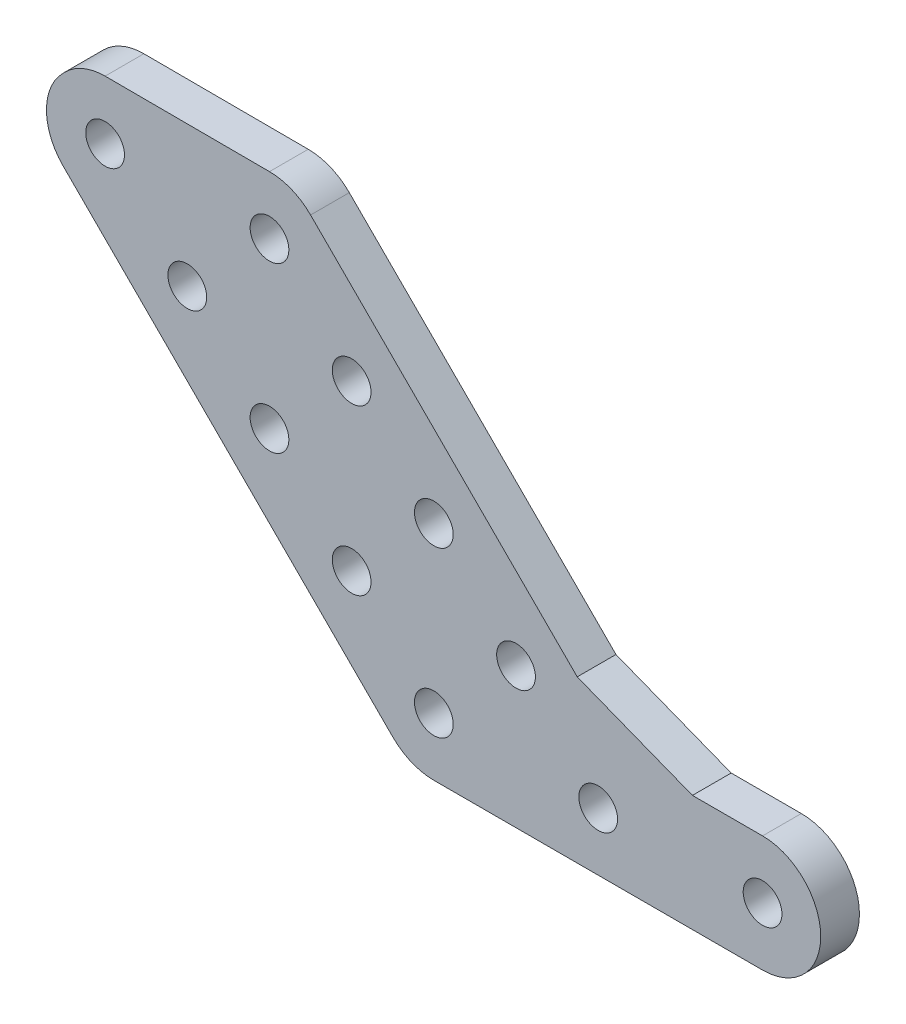
ISO-10303-21;
HEADER;
FILE_DESCRIPTION(('STEP AP214'),'2;1');
FILE_NAME('part.step','',(''),(''),'','','');
FILE_SCHEMA(('AUTOMOTIVE_DESIGN { 1 0 10303 214 1 1 1 1 }'));
ENDSEC;
DATA;
#1=APPLICATION_CONTEXT('core data for automotive mechanical design processes');
#2=APPLICATION_PROTOCOL_DEFINITION('international standard','automotive_design',2000,#1);
#3=PRODUCT_CONTEXT('',#1,'mechanical');
#4=PRODUCT('Part','Part','',(#3));
#5=PRODUCT_RELATED_PRODUCT_CATEGORY('part','',(#4));
#6=PRODUCT_DEFINITION_FORMATION('','',#4);
#7=PRODUCT_DEFINITION_CONTEXT('part definition',#1,'design');
#8=PRODUCT_DEFINITION('design','',#6,#7);
#9=PRODUCT_DEFINITION_SHAPE('','',#8);
#10=(LENGTH_UNIT() NAMED_UNIT(*) SI_UNIT(.MILLI.,.METRE.));
#11=(NAMED_UNIT(*) PLANE_ANGLE_UNIT() SI_UNIT($,.RADIAN.));
#12=(NAMED_UNIT(*) SI_UNIT($,.STERADIAN.) SOLID_ANGLE_UNIT());
#13=UNCERTAINTY_MEASURE_WITH_UNIT(LENGTH_MEASURE(1.E-05),#10,'distance_accuracy_value','');
#14=(GEOMETRIC_REPRESENTATION_CONTEXT(3) GLOBAL_UNCERTAINTY_ASSIGNED_CONTEXT((#13)) GLOBAL_UNIT_ASSIGNED_CONTEXT((#10,
#11,#12)) REPRESENTATION_CONTEXT('',''));
#15=CARTESIAN_POINT('',(0.,0.,0.));
#16=DIRECTION('',(0.,0.,1.));
#17=DIRECTION('',(1.,0.,0.));
#18=AXIS2_PLACEMENT_3D('',#15,#16,#17);
#19=CARTESIAN_POINT('',(237.5387643673,237.5387643673,3.));
#20=DIRECTION('',(0.707106781186548,0.707106781186546,0.));
#21=DIRECTION('',(-0.707106781186547,0.707106781186549,0.));
#22=AXIS2_PLACEMENT_3D('',#19,#20,#21);
#23=PLANE('',#22);
#24=DIRECTION('',(0.707106781186547,-0.707106781186549,0.));
#25=VECTOR('',#24,1.);
#26=CARTESIAN_POINT('',(237.5387643673,237.5387643673,0.));
#27=LINE('',#26,#25);
#28=CARTESIAN_POINT('',(163.6113708686,311.466157866,0.));
#29=VERTEX_POINT('',#28);
#30=CARTESIAN_POINT('',(184.260234476,290.8172942586,0.));
#31=VERTEX_POINT('',#30);
#32=EDGE_CURVE('E184',#29,#31,#27,.T.);
#33=ORIENTED_EDGE('',*,*,#32,.F.);
#34=DIRECTION('',(0.,0.,-1.));
#35=VECTOR('',#34,1.);
#36=CARTESIAN_POINT('',(163.6113708686,311.466157866,3.));
#37=LINE('',#36,#35);
#38=CARTESIAN_POINT('',(163.6113708686,311.466157866,3.));
#39=VERTEX_POINT('',#38);
#40=EDGE_CURVE('E11',#39,#29,#37,.T.);
#41=ORIENTED_EDGE('',*,*,#40,.F.);
#42=DIRECTION('',(0.707106781186547,-0.707106781186549,0.));
#43=VECTOR('',#42,1.);
#44=CARTESIAN_POINT('',(237.5387643673,237.5387643673,3.));
#45=LINE('',#44,#43);
#46=CARTESIAN_POINT('',(184.260234476,290.8172942586,3.));
#47=VERTEX_POINT('',#46);
#48=EDGE_CURVE('E257',#39,#47,#45,.T.);
#49=ORIENTED_EDGE('',*,*,#48,.T.);
#50=DIRECTION('',(0.,0.,-1.));
#51=VECTOR('',#50,1.);
#52=CARTESIAN_POINT('',(184.260234476,290.8172942586,3.));
#53=LINE('',#52,#51);
#54=EDGE_CURVE('E50',#47,#31,#53,.T.);
#55=ORIENTED_EDGE('',*,*,#54,.T.);
#56=EDGE_LOOP('',(#33,#41,#49,#55));
#57=FACE_BOUND('',#56,.T.);
#58=ADVANCED_FACE('F33',(#57),#23,.T.);
#59=CARTESIAN_POINT('',(160.429390353221,308.2841773507,3.));
#60=DIRECTION('',(0.,0.,-1.));
#61=DIRECTION('',(-1.,0.,0.));
#62=AXIS2_PLACEMENT_3D('',#59,#60,#61);
#63=CYLINDRICAL_SURFACE('',#62,4.50000000000005);
#64=CARTESIAN_POINT('',(160.429390353221,308.2841773507,0.));
#65=DIRECTION('',(0.,0.,1.));
#66=DIRECTION('',(1.,0.,0.));
#67=AXIS2_PLACEMENT_3D('',#64,#65,#66);
#68=CIRCLE('',#67,4.50000000000005);
#69=CARTESIAN_POINT('',(160.4293903532,312.7841773507,0.));
#70=VERTEX_POINT('',#69);
#71=EDGE_CURVE('E186',#29,#70,#68,.T.);
#72=ORIENTED_EDGE('',*,*,#71,.T.);
#73=DIRECTION('',(0.,0.,-1.));
#74=VECTOR('',#73,1.);
#75=CARTESIAN_POINT('',(160.4293903532,312.7841773507,3.));
#76=LINE('',#75,#74);
#77=CARTESIAN_POINT('',(160.4293903532,312.7841773507,3.));
#78=VERTEX_POINT('',#77);
#79=EDGE_CURVE('E42',#78,#70,#76,.T.);
#80=ORIENTED_EDGE('',*,*,#79,.F.);
#81=CARTESIAN_POINT('',(160.429390353221,308.2841773507,3.));
#82=DIRECTION('',(0.,0.,1.));
#83=DIRECTION('',(1.,0.,0.));
#84=AXIS2_PLACEMENT_3D('',#81,#82,#83);
#85=CIRCLE('',#84,4.50000000000005);
#86=EDGE_CURVE('E255',#39,#78,#85,.T.);
#87=ORIENTED_EDGE('',*,*,#86,.F.);
#88=ORIENTED_EDGE('',*,*,#40,.T.);
#89=EDGE_LOOP('',(#72,#80,#87,#88));
#90=FACE_BOUND('',#89,.T.);
#91=ADVANCED_FACE('F240',(#90),#63,.T.);
#92=CARTESIAN_POINT('',(1.01960345619282,313.30295563462,3.));
#93=DIRECTION('',(0.00325435186176916,0.999994704582959,0.));
#94=DIRECTION('',(-0.999994704582959,0.00325435186176916,0.));
#95=AXIS2_PLACEMENT_3D('',#92,#93,#94);
#96=PLANE('',#95);
#97=DIRECTION('',(0.999994704582959,-0.00325435186176916,0.));
#98=VECTOR('',#97,1.);
#99=CARTESIAN_POINT('',(1.01960345619282,313.30295563462,0.));
#100=LINE('',#99,#98);
#101=CARTESIAN_POINT('',(147.7014682919,312.8255987069,0.));
#102=VERTEX_POINT('',#101);
#103=EDGE_CURVE('E189',#102,#70,#100,.T.);
#104=ORIENTED_EDGE('',*,*,#103,.F.);
#105=DIRECTION('',(0.,0.,-1.));
#106=VECTOR('',#105,1.);
#107=CARTESIAN_POINT('',(147.7014682919,312.8255987069,3.));
#108=LINE('',#107,#106);
#109=CARTESIAN_POINT('',(147.7014682919,312.8255987069,3.));
#110=VERTEX_POINT('',#109);
#111=EDGE_CURVE('E230',#110,#102,#108,.T.);
#112=ORIENTED_EDGE('',*,*,#111,.F.);
#113=DIRECTION('',(0.999994704582959,-0.00325435186176916,0.));
#114=VECTOR('',#113,1.);
#115=CARTESIAN_POINT('',(1.01960345619282,313.30295563462,3.));
#116=LINE('',#115,#114);
#117=EDGE_CURVE('E237',#110,#78,#116,.T.);
#118=ORIENTED_EDGE('',*,*,#117,.T.);
#119=ORIENTED_EDGE('',*,*,#79,.T.);
#120=EDGE_LOOP('',(#104,#112,#118,#119));
#121=FACE_BOUND('',#120,.T.);
#122=ADVANCED_FACE('F235',(#121),#96,.T.);
#123=CARTESIAN_POINT('',(147.701468291942,308.4255987069,3.));
#124=DIRECTION('',(0.,0.,-1.));
#125=DIRECTION('',(-1.,0.,0.));
#126=AXIS2_PLACEMENT_3D('',#123,#124,#125);
#127=CYLINDRICAL_SURFACE('',#126,4.40000000000009);
#128=CARTESIAN_POINT('',(147.701468291942,308.4255987069,0.));
#129=DIRECTION('',(0.,0.,1.));
#130=DIRECTION('',(1.,0.,0.));
#131=AXIS2_PLACEMENT_3D('',#128,#129,#130);
#132=CIRCLE('',#131,4.40000000000009);
#133=CARTESIAN_POINT('',(144.5901984547,311.5368685441,0.));
#134=VERTEX_POINT('',#133);
#135=EDGE_CURVE('E192',#102,#134,#132,.T.);
#136=ORIENTED_EDGE('',*,*,#135,.T.);
#137=DIRECTION('',(0.,0.,-1.));
#138=VECTOR('',#137,1.);
#139=CARTESIAN_POINT('',(144.5901984547,311.5368685441,3.));
#140=LINE('',#139,#138);
#141=CARTESIAN_POINT('',(144.5901984547,311.5368685441,3.));
#142=VERTEX_POINT('',#141);
#143=EDGE_CURVE('E228',#142,#134,#140,.T.);
#144=ORIENTED_EDGE('',*,*,#143,.F.);
#145=CARTESIAN_POINT('',(147.701468291942,308.4255987069,3.));
#146=DIRECTION('',(0.,0.,1.));
#147=DIRECTION('',(1.,0.,0.));
#148=AXIS2_PLACEMENT_3D('',#145,#146,#147);
#149=CIRCLE('',#148,4.40000000000009);
#150=EDGE_CURVE('E251',#110,#142,#149,.T.);
#151=ORIENTED_EDGE('',*,*,#150,.F.);
#152=ORIENTED_EDGE('',*,*,#111,.T.);
#153=EDGE_LOOP('',(#136,#144,#151,#152));
#154=FACE_BOUND('',#153,.T.);
#155=ADVANCED_FACE('F248',(#154),#127,.T.);
#156=CARTESIAN_POINT('',(-83.4733350958221,83.4733351548486,3.));
#157=DIRECTION('',(-0.707106780936539,0.707106781436556,0.));
#158=DIRECTION('',(-0.707106781436556,-0.707106780936539,0.));
#159=AXIS2_PLACEMENT_3D('',#156,#157,#158);
#160=PLANE('',#159);
#161=DIRECTION('',(0.707106781436556,0.707106780936539,0.));
#162=VECTOR('',#161,1.);
#163=CARTESIAN_POINT('',(-83.4733350958221,83.4733351548486,0.));
#164=LINE('',#163,#162);
#165=CARTESIAN_POINT('',(144.4487770984,311.3954471879,0.));
#166=VERTEX_POINT('',#165);
#167=EDGE_CURVE('E195',#166,#134,#164,.T.);
#168=ORIENTED_EDGE('',*,*,#167,.F.);
#169=DIRECTION('',(0.,0.,-1.));
#170=VECTOR('',#169,1.);
#171=CARTESIAN_POINT('',(144.4487770984,311.3954471879,3.));
#172=LINE('',#171,#170);
#173=CARTESIAN_POINT('',(144.4487770984,311.3954471879,3.));
#174=VERTEX_POINT('',#173);
#175=EDGE_CURVE('E226',#174,#166,#172,.T.);
#176=ORIENTED_EDGE('',*,*,#175,.F.);
#177=DIRECTION('',(0.707106781436556,0.707106780936539,0.));
#178=VECTOR('',#177,1.);
#179=CARTESIAN_POINT('',(-83.4733350958221,83.4733351548486,3.));
#180=LINE('',#179,#178);
#181=EDGE_CURVE('E253',#174,#142,#180,.T.);
#182=ORIENTED_EDGE('',*,*,#181,.T.);
#183=ORIENTED_EDGE('',*,*,#143,.T.);
#184=EDGE_LOOP('',(#168,#176,#182,#183));
#185=FACE_BOUND('',#184,.T.);
#186=ADVANCED_FACE('F497',(#185),#160,.T.);
#187=CARTESIAN_POINT('',(147.560046935642,308.2841773507,3.));
#188=DIRECTION('',(0.,0.,-1.));
#189=DIRECTION('',(-1.,0.,0.));
#190=AXIS2_PLACEMENT_3D('',#187,#188,#189);
#191=CYLINDRICAL_SURFACE('',#190,4.40000000000009);
#192=CARTESIAN_POINT('',(147.560046935642,308.2841773507,0.));
#193=DIRECTION('',(0.,0.,1.));
#194=DIRECTION('',(1.,0.,0.));
#195=AXIS2_PLACEMENT_3D('',#192,#193,#194);
#196=CIRCLE('',#195,4.40000000000009);
#197=CARTESIAN_POINT('',(144.4487770984,305.1729075135,0.));
#198=VERTEX_POINT('',#197);
#199=EDGE_CURVE('E198',#166,#198,#196,.T.);
#200=ORIENTED_EDGE('',*,*,#199,.T.);
#201=DIRECTION('',(0.,0.,-1.));
#202=VECTOR('',#201,1.);
#203=CARTESIAN_POINT('',(144.4487770984,305.1729075135,3.));
#204=LINE('',#203,#202);
#205=CARTESIAN_POINT('',(144.4487770984,305.1729075135,3.));
#206=VERTEX_POINT('',#205);
#207=EDGE_CURVE('E224',#206,#198,#204,.T.);
#208=ORIENTED_EDGE('',*,*,#207,.F.);
#209=CARTESIAN_POINT('',(147.560046935642,308.2841773507,3.));
#210=DIRECTION('',(0.,0.,1.));
#211=DIRECTION('',(1.,0.,0.));
#212=AXIS2_PLACEMENT_3D('',#209,#210,#211);
#213=CIRCLE('',#212,4.40000000000009);
#214=EDGE_CURVE('E262',#174,#206,#213,.T.);
#215=ORIENTED_EDGE('',*,*,#214,.F.);
#216=ORIENTED_EDGE('',*,*,#175,.T.);
#217=EDGE_LOOP('',(#200,#208,#215,#216));
#218=FACE_BOUND('',#217,.T.);
#219=ADVANCED_FACE('F487',(#218),#191,.T.);
#220=CARTESIAN_POINT('',(224.81084230595,224.81084230595,3.));
#221=DIRECTION('',(-0.707106781186547,-0.707106781186548,0.));
#222=DIRECTION('',(0.707106781186548,-0.707106781186547,0.));
#223=AXIS2_PLACEMENT_3D('',#220,#221,#222);
#224=PLANE('',#223);
#225=DIRECTION('',(-0.707106781186548,0.707106781186547,0.));
#226=VECTOR('',#225,1.);
#227=CARTESIAN_POINT('',(224.81084230595,224.81084230595,0.));
#228=LINE('',#227,#226);
#229=CARTESIAN_POINT('',(169.9753318993,279.6463527126,0.));
#230=VERTEX_POINT('',#229);
#231=EDGE_CURVE('E201',#230,#198,#228,.T.);
#232=ORIENTED_EDGE('',*,*,#231,.F.);
#233=DIRECTION('',(0.,0.,-1.));
#234=VECTOR('',#233,1.);
#235=CARTESIAN_POINT('',(169.9753318993,279.6463527126,3.));
#236=LINE('',#235,#234);
#237=CARTESIAN_POINT('',(169.9753318993,279.6463527126,3.));
#238=VERTEX_POINT('',#237);
#239=EDGE_CURVE('E222',#238,#230,#236,.T.);
#240=ORIENTED_EDGE('',*,*,#239,.F.);
#241=DIRECTION('',(-0.707106781186548,0.707106781186547,0.));
#242=VECTOR('',#241,1.);
#243=CARTESIAN_POINT('',(224.81084230595,224.81084230595,3.));
#244=LINE('',#243,#242);
#245=EDGE_CURVE('E264',#238,#206,#244,.T.);
#246=ORIENTED_EDGE('',*,*,#245,.T.);
#247=ORIENTED_EDGE('',*,*,#207,.T.);
#248=EDGE_LOOP('',(#232,#240,#246,#247));
#249=FACE_BOUND('',#248,.T.);
#250=ADVANCED_FACE('F477',(#249),#224,.T.);
#251=CARTESIAN_POINT('',(173.1573124146,282.828333228,3.));
#252=DIRECTION('',(0.,0.,-1.));
#253=DIRECTION('',(-1.,0.,0.));
#254=AXIS2_PLACEMENT_3D('',#251,#252,#253);
#255=CYLINDRICAL_SURFACE('',#254,4.50000000000746);
#256=CARTESIAN_POINT('',(173.1573124146,282.828333228,0.));
#257=DIRECTION('',(0.,0.,1.));
#258=DIRECTION('',(1.,0.,0.));
#259=AXIS2_PLACEMENT_3D('',#256,#257,#258);
#260=CIRCLE('',#259,4.50000000000746);
#261=CARTESIAN_POINT('',(173.1573124146,278.328333228,0.));
#262=VERTEX_POINT('',#261);
#263=EDGE_CURVE('E204',#230,#262,#260,.T.);
#264=ORIENTED_EDGE('',*,*,#263,.T.);
#265=DIRECTION('',(0.,0.,-1.));
#266=VECTOR('',#265,1.);
#267=CARTESIAN_POINT('',(173.1573124146,278.328333228,3.));
#268=LINE('',#267,#266);
#269=CARTESIAN_POINT('',(173.1573124146,278.328333228,3.));
#270=VERTEX_POINT('',#269);
#271=EDGE_CURVE('E220',#270,#262,#268,.T.);
#272=ORIENTED_EDGE('',*,*,#271,.F.);
#273=CARTESIAN_POINT('',(173.1573124146,282.828333228,3.));
#274=DIRECTION('',(0.,0.,1.));
#275=DIRECTION('',(1.,0.,0.));
#276=AXIS2_PLACEMENT_3D('',#273,#274,#275);
#277=CIRCLE('',#276,4.50000000000746);
#278=EDGE_CURVE('E267',#238,#270,#277,.T.);
#279=ORIENTED_EDGE('',*,*,#278,.F.);
#280=ORIENTED_EDGE('',*,*,#239,.T.);
#281=EDGE_LOOP('',(#264,#272,#279,#280));
#282=FACE_BOUND('',#281,.T.);
#283=ADVANCED_FACE('F468',(#282),#255,.T.);
#284=CARTESIAN_POINT('',(0.,278.328333228,3.));
#285=DIRECTION('',(0.,-1.,0.));
#286=DIRECTION('',(0.,0.,-1.));
#287=AXIS2_PLACEMENT_3D('',#284,#285,#286);
#288=PLANE('',#287);
#289=DIRECTION('',(-1.,0.,0.));
#290=VECTOR('',#289,1.);
#291=CARTESIAN_POINT('',(0.,278.328333228,0.));
#292=LINE('',#291,#290);
#293=CARTESIAN_POINT('',(198.6131565373,278.328333228,0.));
#294=VERTEX_POINT('',#293);
#295=EDGE_CURVE('E207',#294,#262,#292,.T.);
#296=ORIENTED_EDGE('',*,*,#295,.F.);
#297=DIRECTION('',(0.,0.,-1.));
#298=VECTOR('',#297,1.);
#299=CARTESIAN_POINT('',(198.6131565373,278.328333228,3.));
#300=LINE('',#299,#298);
#301=CARTESIAN_POINT('',(198.6131565373,278.328333228,3.));
#302=VERTEX_POINT('',#301);
#303=EDGE_CURVE('E143',#302,#294,#300,.T.);
#304=ORIENTED_EDGE('',*,*,#303,.F.);
#305=DIRECTION('',(-1.,0.,0.));
#306=VECTOR('',#305,1.);
#307=CARTESIAN_POINT('',(0.,278.328333228,3.));
#308=LINE('',#307,#306);
#309=EDGE_CURVE('E133',#302,#270,#308,.T.);
#310=ORIENTED_EDGE('',*,*,#309,.T.);
#311=ORIENTED_EDGE('',*,*,#271,.T.);
#312=EDGE_LOOP('',(#296,#304,#310,#311));
#313=FACE_BOUND('',#312,.T.);
#314=ADVANCED_FACE('F270',(#313),#288,.T.);
#315=CARTESIAN_POINT('',(198.6131565373,282.828333228,3.));
#316=DIRECTION('',(0.,0.,-1.));
#317=DIRECTION('',(-1.,0.,0.));
#318=AXIS2_PLACEMENT_3D('',#315,#316,#317);
#319=CYLINDRICAL_SURFACE('',#318,4.49999999999998);
#320=CARTESIAN_POINT('',(198.6131565373,282.828333228,0.));
#321=DIRECTION('',(0.,0.,1.));
#322=DIRECTION('',(1.,0.,0.));
#323=AXIS2_PLACEMENT_3D('',#320,#321,#322);
#324=CIRCLE('',#323,4.49999999999998);
#325=CARTESIAN_POINT('',(198.6131565373,287.328333228,0.));
#326=VERTEX_POINT('',#325);
#327=EDGE_CURVE('E140',#294,#326,#324,.T.);
#328=ORIENTED_EDGE('',*,*,#327,.T.);
#329=DIRECTION('',(0.,0.,-1.));
#330=VECTOR('',#329,1.);
#331=CARTESIAN_POINT('',(198.6131565373,287.328333228,3.));
#332=LINE('',#331,#330);
#333=CARTESIAN_POINT('',(198.6131565373,287.328333228,3.));
#334=VERTEX_POINT('',#333);
#335=EDGE_CURVE('E137',#334,#326,#332,.T.);
#336=ORIENTED_EDGE('',*,*,#335,.F.);
#337=CARTESIAN_POINT('',(198.6131565373,282.828333228,3.));
#338=DIRECTION('',(0.,0.,1.));
#339=DIRECTION('',(1.,0.,0.));
#340=AXIS2_PLACEMENT_3D('',#337,#338,#339);
#341=CIRCLE('',#340,4.49999999999998);
#342=EDGE_CURVE('E125',#302,#334,#341,.T.);
#343=ORIENTED_EDGE('',*,*,#342,.F.);
#344=ORIENTED_EDGE('',*,*,#303,.T.);
#345=EDGE_LOOP('',(#328,#336,#343,#344));
#346=FACE_BOUND('',#345,.T.);
#347=ADVANCED_FACE('F138',(#346),#319,.T.);
#348=CARTESIAN_POINT('',(0.,287.328333228,3.));
#349=DIRECTION('',(0.,1.,0.));
#350=DIRECTION('',(0.,0.,1.));
#351=AXIS2_PLACEMENT_3D('',#348,#349,#350);
#352=PLANE('',#351);
#353=DIRECTION('',(1.,0.,0.));
#354=VECTOR('',#353,1.);
#355=CARTESIAN_POINT('',(0.,287.328333228,0.));
#356=LINE('',#355,#354);
#357=CARTESIAN_POINT('',(193.181176022,287.328333228,0.));
#358=VERTEX_POINT('',#357);
#359=EDGE_CURVE('E211',#358,#326,#356,.T.);
#360=ORIENTED_EDGE('',*,*,#359,.F.);
#361=DIRECTION('',(0.,0.,-1.));
#362=VECTOR('',#361,1.);
#363=CARTESIAN_POINT('',(193.181176022,287.328333228,3.));
#364=LINE('',#363,#362);
#365=CARTESIAN_POINT('',(193.181176022,287.328333228,3.));
#366=VERTEX_POINT('',#365);
#367=EDGE_CURVE('E87',#366,#358,#364,.T.);
#368=ORIENTED_EDGE('',*,*,#367,.F.);
#369=DIRECTION('',(1.,0.,0.));
#370=VECTOR('',#369,1.);
#371=CARTESIAN_POINT('',(0.,287.328333228,3.));
#372=LINE('',#371,#370);
#373=EDGE_CURVE('E131',#366,#334,#372,.T.);
#374=ORIENTED_EDGE('',*,*,#373,.T.);
#375=ORIENTED_EDGE('',*,*,#335,.T.);
#376=EDGE_LOOP('',(#360,#368,#374,#375));
#377=FACE_BOUND('',#376,.T.);
#378=ADVANCED_FACE('F145',(#377),#352,.T.);
#379=CARTESIAN_POINT('',(179.5212734453,289.1922942586,3.));
#380=DIRECTION('',(0.,0.,-1.));
#381=DIRECTION('',(-1.,0.,0.));
#382=AXIS2_PLACEMENT_3D('',#379,#380,#381);
#383=CYLINDRICAL_SURFACE('',#382,1.5);
#384=CARTESIAN_POINT('',(179.5212734453,289.1922942586,3.));
#385=DIRECTION('',(0.,0.,1.));
#386=DIRECTION('',(1.,0.,0.));
#387=AXIS2_PLACEMENT_3D('',#384,#385,#386);
#388=CIRCLE('',#387,1.5);
#389=CARTESIAN_POINT('',(181.0212734453,289.1922942586,3.));
#390=VERTEX_POINT('',#389);
#391=EDGE_CURVE('E572',#390,#390,#388,.T.);
#392=ORIENTED_EDGE('',*,*,#391,.T.);
#393=EDGE_LOOP('',(#392));
#394=FACE_BOUND('',#393,.T.);
#395=CARTESIAN_POINT('',(179.5212734453,289.1922942586,0.));
#396=DIRECTION('',(0.,0.,1.));
#397=DIRECTION('',(1.,0.,0.));
#398=AXIS2_PLACEMENT_3D('',#395,#396,#397);
#399=CIRCLE('',#398,1.5);
#400=CARTESIAN_POINT('',(181.0212734453,289.1922942586,0.));
#401=VERTEX_POINT('',#400);
#402=EDGE_CURVE('E181',#401,#401,#399,.T.);
#403=ORIENTED_EDGE('',*,*,#402,.F.);
#404=EDGE_LOOP('',(#403));
#405=FACE_BOUND('',#404,.T.);
#406=ADVANCED_FACE('F294',(#394,#405),#383,.F.);
#407=CARTESIAN_POINT('',(173.1573124146,295.5562552893,3.));
#408=DIRECTION('',(0.,0.,-1.));
#409=DIRECTION('',(-1.,0.,0.));
#410=AXIS2_PLACEMENT_3D('',#407,#408,#409);
#411=CYLINDRICAL_SURFACE('',#410,1.5);
#412=CARTESIAN_POINT('',(173.1573124146,295.5562552893,3.));
#413=DIRECTION('',(0.,0.,1.));
#414=DIRECTION('',(1.,0.,0.));
#415=AXIS2_PLACEMENT_3D('',#412,#413,#414);
#416=CIRCLE('',#415,1.5);
#417=CARTESIAN_POINT('',(174.6573124146,295.5562552893,3.));
#418=VERTEX_POINT('',#417);
#419=EDGE_CURVE('E569',#418,#418,#416,.T.);
#420=ORIENTED_EDGE('',*,*,#419,.T.);
#421=EDGE_LOOP('',(#420));
#422=FACE_BOUND('',#421,.T.);
#423=CARTESIAN_POINT('',(173.1573124146,295.5562552893,0.));
#424=DIRECTION('',(0.,0.,1.));
#425=DIRECTION('',(1.,0.,0.));
#426=AXIS2_PLACEMENT_3D('',#423,#424,#425);
#427=CIRCLE('',#426,1.5);
#428=CARTESIAN_POINT('',(174.6573124146,295.5562552893,0.));
#429=VERTEX_POINT('',#428);
#430=EDGE_CURVE('E178',#429,#429,#427,.T.);
#431=ORIENTED_EDGE('',*,*,#430,.F.);
#432=EDGE_LOOP('',(#431));
#433=FACE_BOUND('',#432,.T.);
#434=ADVANCED_FACE('F297',(#422,#433),#411,.F.);
#435=CARTESIAN_POINT('',(166.7933513839,301.92021632,3.));
#436=DIRECTION('',(0.,0.,-1.));
#437=DIRECTION('',(-1.,0.,0.));
#438=AXIS2_PLACEMENT_3D('',#435,#436,#437);
#439=CYLINDRICAL_SURFACE('',#438,1.5);
#440=CARTESIAN_POINT('',(166.7933513839,301.92021632,3.));
#441=DIRECTION('',(0.,0.,1.));
#442=DIRECTION('',(1.,0.,0.));
#443=AXIS2_PLACEMENT_3D('',#440,#441,#442);
#444=CIRCLE('',#443,1.5);
#445=CARTESIAN_POINT('',(168.2933513839,301.92021632,3.));
#446=VERTEX_POINT('',#445);
#447=EDGE_CURVE('E566',#446,#446,#444,.T.);
#448=ORIENTED_EDGE('',*,*,#447,.T.);
#449=EDGE_LOOP('',(#448));
#450=FACE_BOUND('',#449,.T.);
#451=CARTESIAN_POINT('',(166.7933513839,301.92021632,0.));
#452=DIRECTION('',(0.,0.,1.));
#453=DIRECTION('',(1.,0.,0.));
#454=AXIS2_PLACEMENT_3D('',#451,#452,#453);
#455=CIRCLE('',#454,1.5);
#456=CARTESIAN_POINT('',(168.2933513839,301.92021632,0.));
#457=VERTEX_POINT('',#456);
#458=EDGE_CURVE('E175',#457,#457,#455,.T.);
#459=ORIENTED_EDGE('',*,*,#458,.F.);
#460=EDGE_LOOP('',(#459));
#461=FACE_BOUND('',#460,.T.);
#462=ADVANCED_FACE('F301',(#450,#461),#439,.F.);
#463=CARTESIAN_POINT('',(185.885234476,282.828333228,3.));
#464=DIRECTION('',(0.,0.,-1.));
#465=DIRECTION('',(-1.,0.,0.));
#466=AXIS2_PLACEMENT_3D('',#463,#464,#465);
#467=CYLINDRICAL_SURFACE('',#466,1.5);
#468=CARTESIAN_POINT('',(185.885234476,282.828333228,3.));
#469=DIRECTION('',(0.,0.,1.));
#470=DIRECTION('',(1.,0.,0.));
#471=AXIS2_PLACEMENT_3D('',#468,#469,#470);
#472=CIRCLE('',#471,1.5);
#473=CARTESIAN_POINT('',(187.385234476,282.828333228,3.));
#474=VERTEX_POINT('',#473);
#475=EDGE_CURVE('E563',#474,#474,#472,.T.);
#476=ORIENTED_EDGE('',*,*,#475,.T.);
#477=EDGE_LOOP('',(#476));
#478=FACE_BOUND('',#477,.T.);
#479=CARTESIAN_POINT('',(185.885234476,282.828333228,0.));
#480=DIRECTION('',(0.,0.,1.));
#481=DIRECTION('',(1.,0.,0.));
#482=AXIS2_PLACEMENT_3D('',#479,#480,#481);
#483=CIRCLE('',#482,1.5);
#484=CARTESIAN_POINT('',(187.385234476,282.828333228,0.));
#485=VERTEX_POINT('',#484);
#486=EDGE_CURVE('E172',#485,#485,#483,.T.);
#487=ORIENTED_EDGE('',*,*,#486,.F.);
#488=EDGE_LOOP('',(#487));
#489=FACE_BOUND('',#488,.T.);
#490=ADVANCED_FACE('F305',(#478,#489),#467,.F.);
#491=CARTESIAN_POINT('',(198.6131565373,282.828333228,3.));
#492=DIRECTION('',(0.,0.,-1.));
#493=DIRECTION('',(-1.,0.,0.));
#494=AXIS2_PLACEMENT_3D('',#491,#492,#493);
#495=CYLINDRICAL_SURFACE('',#494,1.5);
#496=CARTESIAN_POINT('',(198.6131565373,282.828333228,3.));
#497=DIRECTION('',(0.,0.,1.));
#498=DIRECTION('',(1.,0.,0.));
#499=AXIS2_PLACEMENT_3D('',#496,#497,#498);
#500=CIRCLE('',#499,1.5);
#501=CARTESIAN_POINT('',(200.1131565373,282.828333228,3.));
#502=VERTEX_POINT('',#501);
#503=EDGE_CURVE('E560',#502,#502,#500,.T.);
#504=ORIENTED_EDGE('',*,*,#503,.T.);
#505=EDGE_LOOP('',(#504));
#506=FACE_BOUND('',#505,.T.);
#507=CARTESIAN_POINT('',(198.6131565373,282.828333228,0.));
#508=DIRECTION('',(0.,0.,1.));
#509=DIRECTION('',(1.,0.,0.));
#510=AXIS2_PLACEMENT_3D('',#507,#508,#509);
#511=CIRCLE('',#510,1.5);
#512=CARTESIAN_POINT('',(200.1131565373,282.828333228,0.));
#513=VERTEX_POINT('',#512);
#514=EDGE_CURVE('E169',#513,#513,#511,.T.);
#515=ORIENTED_EDGE('',*,*,#514,.F.);
#516=EDGE_LOOP('',(#515));
#517=FACE_BOUND('',#516,.T.);
#518=ADVANCED_FACE('F309',(#506,#517),#495,.F.);
#519=CARTESIAN_POINT('',(173.1573124146,282.828333228,3.));
#520=DIRECTION('',(0.,0.,-1.));
#521=DIRECTION('',(-1.,0.,0.));
#522=AXIS2_PLACEMENT_3D('',#519,#520,#521);
#523=CYLINDRICAL_SURFACE('',#522,1.5);
#524=CARTESIAN_POINT('',(173.1573124146,282.828333228,3.));
#525=DIRECTION('',(0.,0.,1.));
#526=DIRECTION('',(1.,0.,0.));
#527=AXIS2_PLACEMENT_3D('',#524,#525,#526);
#528=CIRCLE('',#527,1.5);
#529=CARTESIAN_POINT('',(174.6573124146,282.828333228,3.));
#530=VERTEX_POINT('',#529);
#531=EDGE_CURVE('E557',#530,#530,#528,.T.);
#532=ORIENTED_EDGE('',*,*,#531,.T.);
#533=EDGE_LOOP('',(#532));
#534=FACE_BOUND('',#533,.T.);
#535=CARTESIAN_POINT('',(173.1573124146,282.828333228,0.));
#536=DIRECTION('',(0.,0.,1.));
#537=DIRECTION('',(1.,0.,0.));
#538=AXIS2_PLACEMENT_3D('',#535,#536,#537);
#539=CIRCLE('',#538,1.5);
#540=CARTESIAN_POINT('',(174.6573124146,282.828333228,0.));
#541=VERTEX_POINT('',#540);
#542=EDGE_CURVE('E166',#541,#541,#539,.T.);
#543=ORIENTED_EDGE('',*,*,#542,.F.);
#544=EDGE_LOOP('',(#543));
#545=FACE_BOUND('',#544,.T.);
#546=ADVANCED_FACE('F313',(#534,#545),#523,.F.);
#547=CARTESIAN_POINT('',(154.0654293226,301.92021632,3.));
#548=DIRECTION('',(0.,0.,-1.));
#549=DIRECTION('',(-1.,0.,0.));
#550=AXIS2_PLACEMENT_3D('',#547,#548,#549);
#551=CYLINDRICAL_SURFACE('',#550,1.5);
#552=CARTESIAN_POINT('',(154.0654293226,301.92021632,3.));
#553=DIRECTION('',(0.,0.,1.));
#554=DIRECTION('',(1.,0.,0.));
#555=AXIS2_PLACEMENT_3D('',#552,#553,#554);
#556=CIRCLE('',#555,1.5);
#557=CARTESIAN_POINT('',(155.5654293226,301.92021632,3.));
#558=VERTEX_POINT('',#557);
#559=EDGE_CURVE('E554',#558,#558,#556,.T.);
#560=ORIENTED_EDGE('',*,*,#559,.T.);
#561=EDGE_LOOP('',(#560));
#562=FACE_BOUND('',#561,.T.);
#563=CARTESIAN_POINT('',(154.0654293226,301.92021632,0.));
#564=DIRECTION('',(0.,0.,1.));
#565=DIRECTION('',(1.,0.,0.));
#566=AXIS2_PLACEMENT_3D('',#563,#564,#565);
#567=CIRCLE('',#566,1.5);
#568=CARTESIAN_POINT('',(155.5654293226,301.92021632,0.));
#569=VERTEX_POINT('',#568);
#570=EDGE_CURVE('E163',#569,#569,#567,.T.);
#571=ORIENTED_EDGE('',*,*,#570,.F.);
#572=EDGE_LOOP('',(#571));
#573=FACE_BOUND('',#572,.T.);
#574=ADVANCED_FACE('F317',(#562,#573),#551,.F.);
#575=CARTESIAN_POINT('',(166.7933513839,289.1922942586,3.));
#576=DIRECTION('',(0.,0.,-1.));
#577=DIRECTION('',(-1.,0.,0.));
#578=AXIS2_PLACEMENT_3D('',#575,#576,#577);
#579=CYLINDRICAL_SURFACE('',#578,1.5);
#580=CARTESIAN_POINT('',(166.7933513839,289.1922942586,3.));
#581=DIRECTION('',(0.,0.,1.));
#582=DIRECTION('',(1.,0.,0.));
#583=AXIS2_PLACEMENT_3D('',#580,#581,#582);
#584=CIRCLE('',#583,1.5);
#585=CARTESIAN_POINT('',(168.2933513839,289.1922942586,3.));
#586=VERTEX_POINT('',#585);
#587=EDGE_CURVE('E547',#586,#586,#584,.T.);
#588=ORIENTED_EDGE('',*,*,#587,.T.);
#589=EDGE_LOOP('',(#588));
#590=FACE_BOUND('',#589,.T.);
#591=CARTESIAN_POINT('',(166.7933513839,289.1922942586,0.));
#592=DIRECTION('',(0.,0.,1.));
#593=DIRECTION('',(1.,0.,0.));
#594=AXIS2_PLACEMENT_3D('',#591,#592,#593);
#595=CIRCLE('',#594,1.5);
#596=CARTESIAN_POINT('',(168.2933513839,289.1922942586,0.));
#597=VERTEX_POINT('',#596);
#598=EDGE_CURVE('E160',#597,#597,#595,.T.);
#599=ORIENTED_EDGE('',*,*,#598,.F.);
#600=EDGE_LOOP('',(#599));
#601=FACE_BOUND('',#600,.T.);
#602=ADVANCED_FACE('F321',(#590,#601),#579,.F.);
#603=CARTESIAN_POINT('',(160.4293903532,295.5562552893,3.));
#604=DIRECTION('',(0.,0.,-1.));
#605=DIRECTION('',(-1.,0.,0.));
#606=AXIS2_PLACEMENT_3D('',#603,#604,#605);
#607=CYLINDRICAL_SURFACE('',#606,1.5);
#608=CARTESIAN_POINT('',(160.4293903532,295.5562552893,3.));
#609=DIRECTION('',(0.,0.,1.));
#610=DIRECTION('',(1.,0.,0.));
#611=AXIS2_PLACEMENT_3D('',#608,#609,#610);
#612=CIRCLE('',#611,1.5);
#613=CARTESIAN_POINT('',(161.9293903532,295.5562552893,3.));
#614=VERTEX_POINT('',#613);
#615=EDGE_CURVE('E544',#614,#614,#612,.T.);
#616=ORIENTED_EDGE('',*,*,#615,.T.);
#617=EDGE_LOOP('',(#616));
#618=FACE_BOUND('',#617,.T.);
#619=CARTESIAN_POINT('',(160.4293903532,295.5562552893,0.));
#620=DIRECTION('',(0.,0.,1.));
#621=DIRECTION('',(1.,0.,0.));
#622=AXIS2_PLACEMENT_3D('',#619,#620,#621);
#623=CIRCLE('',#622,1.5);
#624=CARTESIAN_POINT('',(161.9293903532,295.5562552893,0.));
#625=VERTEX_POINT('',#624);
#626=EDGE_CURVE('E157',#625,#625,#623,.T.);
#627=ORIENTED_EDGE('',*,*,#626,.F.);
#628=EDGE_LOOP('',(#627));
#629=FACE_BOUND('',#628,.T.);
#630=ADVANCED_FACE('F325',(#618,#629),#607,.F.);
#631=CARTESIAN_POINT('',(147.7014682919,308.2841773507,3.));
#632=DIRECTION('',(0.,0.,-1.));
#633=DIRECTION('',(-1.,0.,0.));
#634=AXIS2_PLACEMENT_3D('',#631,#632,#633);
#635=CYLINDRICAL_SURFACE('',#634,1.5);
#636=CARTESIAN_POINT('',(147.7014682919,308.2841773507,3.));
#637=DIRECTION('',(0.,0.,1.));
#638=DIRECTION('',(1.,0.,0.));
#639=AXIS2_PLACEMENT_3D('',#636,#637,#638);
#640=CIRCLE('',#639,1.5);
#641=CARTESIAN_POINT('',(149.2014682919,308.2841773507,3.));
#642=VERTEX_POINT('',#641);
#643=EDGE_CURVE('E336',#642,#642,#640,.T.);
#644=ORIENTED_EDGE('',*,*,#643,.T.);
#645=EDGE_LOOP('',(#644));
#646=FACE_BOUND('',#645,.T.);
#647=CARTESIAN_POINT('',(147.7014682919,308.2841773507,0.));
#648=DIRECTION('',(0.,0.,1.));
#649=DIRECTION('',(1.,0.,0.));
#650=AXIS2_PLACEMENT_3D('',#647,#648,#649);
#651=CIRCLE('',#650,1.5);
#652=CARTESIAN_POINT('',(149.2014682919,308.2841773507,0.));
#653=VERTEX_POINT('',#652);
#654=EDGE_CURVE('E154',#653,#653,#651,.T.);
#655=ORIENTED_EDGE('',*,*,#654,.F.);
#656=EDGE_LOOP('',(#655));
#657=FACE_BOUND('',#656,.T.);
#658=ADVANCED_FACE('F282',(#646,#657),#635,.F.);
#659=CARTESIAN_POINT('',(160.429390353221,308.2841773507,3.));
#660=DIRECTION('',(0.,0.,-1.));
#661=DIRECTION('',(-1.,0.,0.));
#662=AXIS2_PLACEMENT_3D('',#659,#660,#661);
#663=CYLINDRICAL_SURFACE('',#662,1.49999999997893);
#664=CARTESIAN_POINT('',(160.429390353221,308.2841773507,3.));
#665=DIRECTION('',(0.,0.,1.));
#666=DIRECTION('',(1.,0.,0.));
#667=AXIS2_PLACEMENT_3D('',#664,#665,#666);
#668=CIRCLE('',#667,1.49999999997893);
#669=CARTESIAN_POINT('',(161.9293903532,308.2841773507,3.));
#670=VERTEX_POINT('',#669);
#671=EDGE_CURVE('E216',#670,#670,#668,.T.);
#672=ORIENTED_EDGE('',*,*,#671,.T.);
#673=EDGE_LOOP('',(#672));
#674=FACE_BOUND('',#673,.T.);
#675=CARTESIAN_POINT('',(160.429390353221,308.2841773507,0.));
#676=DIRECTION('',(0.,0.,1.));
#677=DIRECTION('',(1.,0.,0.));
#678=AXIS2_PLACEMENT_3D('',#675,#676,#677);
#679=CIRCLE('',#678,1.49999999997893);
#680=CARTESIAN_POINT('',(161.9293903532,308.2841773507,0.));
#681=VERTEX_POINT('',#680);
#682=EDGE_CURVE('E151',#681,#681,#679,.T.);
#683=ORIENTED_EDGE('',*,*,#682,.F.);
#684=EDGE_LOOP('',(#683));
#685=FACE_BOUND('',#684,.T.);
#686=ADVANCED_FACE('F35',(#674,#685),#663,.F.);
#687=CARTESIAN_POINT('',(123.093872938166,314.739326556276,3.));
#688=DIRECTION('',(0.364232563772633,0.931308026105013,0.));
#689=DIRECTION('',(-0.931308026105013,0.364232563772633,0.));
#690=AXIS2_PLACEMENT_3D('',#687,#688,#689);
#691=PLANE('',#690);
#692=DIRECTION('',(0.931308026105013,-0.364232563772633,0.));
#693=VECTOR('',#692,1.);
#694=CARTESIAN_POINT('',(123.093872938166,314.739326556276,0.));
#695=LINE('',#694,#693);
#696=EDGE_CURVE('E213',#31,#358,#695,.T.);
#697=ORIENTED_EDGE('',*,*,#696,.F.);
#698=ORIENTED_EDGE('',*,*,#54,.F.);
#699=DIRECTION('',(0.931308026105013,-0.364232563772633,0.));
#700=VECTOR('',#699,1.);
#701=CARTESIAN_POINT('',(123.093872938166,314.739326556276,3.));
#702=LINE('',#701,#700);
#703=EDGE_CURVE('E146',#47,#366,#702,.T.);
#704=ORIENTED_EDGE('',*,*,#703,.T.);
#705=ORIENTED_EDGE('',*,*,#367,.T.);
#706=EDGE_LOOP('',(#697,#698,#704,#705));
#707=FACE_BOUND('',#706,.T.);
#708=ADVANCED_FACE('F273',(#707),#691,.T.);
#709=CARTESIAN_POINT('',(0.,0.,3.));
#710=DIRECTION('',(0.,0.,1.));
#711=DIRECTION('',(1.,0.,0.));
#712=AXIS2_PLACEMENT_3D('',#709,#710,#711);
#713=PLANE('',#712);
#714=ORIENTED_EDGE('',*,*,#671,.F.);
#715=EDGE_LOOP('',(#714));
#716=FACE_BOUND('',#715,.T.);
#717=ORIENTED_EDGE('',*,*,#643,.F.);
#718=EDGE_LOOP('',(#717));
#719=FACE_BOUND('',#718,.T.);
#720=ORIENTED_EDGE('',*,*,#615,.F.);
#721=EDGE_LOOP('',(#720));
#722=FACE_BOUND('',#721,.T.);
#723=ORIENTED_EDGE('',*,*,#587,.F.);
#724=EDGE_LOOP('',(#723));
#725=FACE_BOUND('',#724,.T.);
#726=ORIENTED_EDGE('',*,*,#559,.F.);
#727=EDGE_LOOP('',(#726));
#728=FACE_BOUND('',#727,.T.);
#729=ORIENTED_EDGE('',*,*,#531,.F.);
#730=EDGE_LOOP('',(#729));
#731=FACE_BOUND('',#730,.T.);
#732=ORIENTED_EDGE('',*,*,#503,.F.);
#733=EDGE_LOOP('',(#732));
#734=FACE_BOUND('',#733,.T.);
#735=ORIENTED_EDGE('',*,*,#475,.F.);
#736=EDGE_LOOP('',(#735));
#737=FACE_BOUND('',#736,.T.);
#738=ORIENTED_EDGE('',*,*,#447,.F.);
#739=EDGE_LOOP('',(#738));
#740=FACE_BOUND('',#739,.T.);
#741=ORIENTED_EDGE('',*,*,#419,.F.);
#742=EDGE_LOOP('',(#741));
#743=FACE_BOUND('',#742,.T.);
#744=ORIENTED_EDGE('',*,*,#391,.F.);
#745=EDGE_LOOP('',(#744));
#746=FACE_BOUND('',#745,.T.);
#747=ORIENTED_EDGE('',*,*,#48,.F.);
#748=ORIENTED_EDGE('',*,*,#86,.T.);
#749=ORIENTED_EDGE('',*,*,#117,.F.);
#750=ORIENTED_EDGE('',*,*,#150,.T.);
#751=ORIENTED_EDGE('',*,*,#181,.F.);
#752=ORIENTED_EDGE('',*,*,#214,.T.);
#753=ORIENTED_EDGE('',*,*,#245,.F.);
#754=ORIENTED_EDGE('',*,*,#278,.T.);
#755=ORIENTED_EDGE('',*,*,#309,.F.);
#756=ORIENTED_EDGE('',*,*,#342,.T.);
#757=ORIENTED_EDGE('',*,*,#373,.F.);
#758=ORIENTED_EDGE('',*,*,#703,.F.);
#759=EDGE_LOOP('',(#747,#748,#749,#750,#751,#752,#753,#754,#755,#756,#757,#758));
#760=FACE_BOUND('',#759,.T.);
#761=ADVANCED_FACE('F128',(#716,#719,#722,#725,#728,#731,#734,#737,#740,#743,#746,#760),#713,.T.);
#762=CARTESIAN_POINT('',(0.,0.,0.));
#763=DIRECTION('',(0.,0.,1.));
#764=DIRECTION('',(1.,0.,0.));
#765=AXIS2_PLACEMENT_3D('',#762,#763,#764);
#766=PLANE('',#765);
#767=ORIENTED_EDGE('',*,*,#682,.T.);
#768=EDGE_LOOP('',(#767));
#769=FACE_BOUND('',#768,.T.);
#770=ORIENTED_EDGE('',*,*,#654,.T.);
#771=EDGE_LOOP('',(#770));
#772=FACE_BOUND('',#771,.T.);
#773=ORIENTED_EDGE('',*,*,#626,.T.);
#774=EDGE_LOOP('',(#773));
#775=FACE_BOUND('',#774,.T.);
#776=ORIENTED_EDGE('',*,*,#598,.T.);
#777=EDGE_LOOP('',(#776));
#778=FACE_BOUND('',#777,.T.);
#779=ORIENTED_EDGE('',*,*,#570,.T.);
#780=EDGE_LOOP('',(#779));
#781=FACE_BOUND('',#780,.T.);
#782=ORIENTED_EDGE('',*,*,#542,.T.);
#783=EDGE_LOOP('',(#782));
#784=FACE_BOUND('',#783,.T.);
#785=ORIENTED_EDGE('',*,*,#514,.T.);
#786=EDGE_LOOP('',(#785));
#787=FACE_BOUND('',#786,.T.);
#788=ORIENTED_EDGE('',*,*,#486,.T.);
#789=EDGE_LOOP('',(#788));
#790=FACE_BOUND('',#789,.T.);
#791=ORIENTED_EDGE('',*,*,#458,.T.);
#792=EDGE_LOOP('',(#791));
#793=FACE_BOUND('',#792,.T.);
#794=ORIENTED_EDGE('',*,*,#430,.T.);
#795=EDGE_LOOP('',(#794));
#796=FACE_BOUND('',#795,.T.);
#797=ORIENTED_EDGE('',*,*,#402,.T.);
#798=EDGE_LOOP('',(#797));
#799=FACE_BOUND('',#798,.T.);
#800=ORIENTED_EDGE('',*,*,#32,.T.);
#801=ORIENTED_EDGE('',*,*,#696,.T.);
#802=ORIENTED_EDGE('',*,*,#359,.T.);
#803=ORIENTED_EDGE('',*,*,#327,.F.);
#804=ORIENTED_EDGE('',*,*,#295,.T.);
#805=ORIENTED_EDGE('',*,*,#263,.F.);
#806=ORIENTED_EDGE('',*,*,#231,.T.);
#807=ORIENTED_EDGE('',*,*,#199,.F.);
#808=ORIENTED_EDGE('',*,*,#167,.T.);
#809=ORIENTED_EDGE('',*,*,#135,.F.);
#810=ORIENTED_EDGE('',*,*,#103,.T.);
#811=ORIENTED_EDGE('',*,*,#71,.F.);
#812=EDGE_LOOP('',(#800,#801,#802,#803,#804,#805,#806,#807,#808,#809,#810,#811));
#813=FACE_BOUND('',#812,.T.);
#814=ADVANCED_FACE('F243',(#769,#772,#775,#778,#781,#784,#787,#790,#793,#796,#799,#813),#766,.F.);
#815=CLOSED_SHELL('',(#58,#91,#122,#155,#186,#219,#250,#283,#314,#347,#378,#406,#434,#462,#490,
#518,#546,#574,#602,#630,#658,#686,#708,#761,#814));
#816=MANIFOLD_SOLID_BREP('B2',#815);
#817=ADVANCED_BREP_SHAPE_REPRESENTATION('',(#18,#816),#14);
#818=SHAPE_DEFINITION_REPRESENTATION(#9,#817);
ENDSEC;
END-ISO-10303-21;
